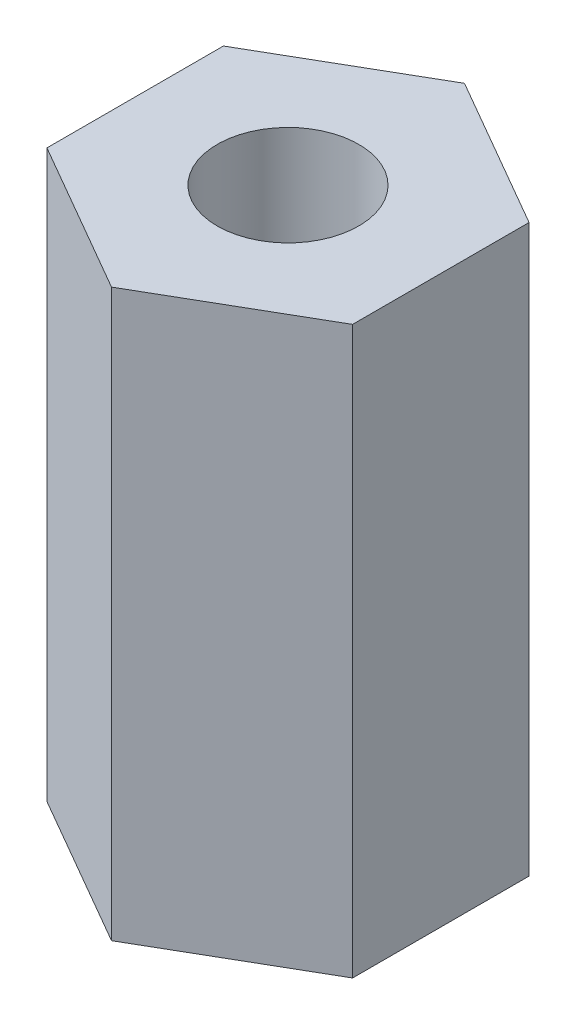
ISO-10303-21;
HEADER;
FILE_DESCRIPTION(('STEP AP214'),'2;1');
FILE_NAME('part.step','',(''),(''),'','','');
FILE_SCHEMA(('AUTOMOTIVE_DESIGN { 1 0 10303 214 1 1 1 1 }'));
ENDSEC;
DATA;
#1=APPLICATION_CONTEXT('core data for automotive mechanical design processes');
#2=APPLICATION_PROTOCOL_DEFINITION('international standard','automotive_design',2000,#1);
#3=PRODUCT_CONTEXT('',#1,'mechanical');
#4=PRODUCT('Part','Part','',(#3));
#5=PRODUCT_RELATED_PRODUCT_CATEGORY('part','',(#4));
#6=PRODUCT_DEFINITION_FORMATION('','',#4);
#7=PRODUCT_DEFINITION_CONTEXT('part definition',#1,'design');
#8=PRODUCT_DEFINITION('design','',#6,#7);
#9=PRODUCT_DEFINITION_SHAPE('','',#8);
#10=(LENGTH_UNIT() NAMED_UNIT(*) SI_UNIT(.MILLI.,.METRE.));
#11=(NAMED_UNIT(*) PLANE_ANGLE_UNIT() SI_UNIT($,.RADIAN.));
#12=(NAMED_UNIT(*) SI_UNIT($,.STERADIAN.) SOLID_ANGLE_UNIT());
#13=UNCERTAINTY_MEASURE_WITH_UNIT(LENGTH_MEASURE(1.E-05),#10,'distance_accuracy_value','');
#14=(GEOMETRIC_REPRESENTATION_CONTEXT(3) GLOBAL_UNCERTAINTY_ASSIGNED_CONTEXT((#13)) GLOBAL_UNIT_ASSIGNED_CONTEXT((#10,
#11,#12)) REPRESENTATION_CONTEXT('',''));
#15=CARTESIAN_POINT('',(0.,0.,0.));
#16=DIRECTION('',(0.,0.,1.));
#17=DIRECTION('',(1.,0.,0.));
#18=AXIS2_PLACEMENT_3D('',#15,#16,#17);
#19=CARTESIAN_POINT('',(2.7,10.,-1.55884572681199));
#20=DIRECTION('',(-0.5,0.,0.866025403784439));
#21=DIRECTION('',(0.866025403784439,0.,0.5));
#22=AXIS2_PLACEMENT_3D('',#19,#20,#21);
#23=PLANE('',#22);
#24=DIRECTION('',(-0.866025403784439,0.,-0.5));
#25=VECTOR('',#24,1.);
#26=CARTESIAN_POINT('',(2.7,0.,-1.55884572681199));
#27=LINE('',#26,#25);
#28=CARTESIAN_POINT('',(2.7,0.,-1.55884572681199));
#29=VERTEX_POINT('',#28);
#30=CARTESIAN_POINT('',(0.,0.,-3.11769145362398));
#31=VERTEX_POINT('',#30);
#32=EDGE_CURVE('E118',#29,#31,#27,.T.);
#33=ORIENTED_EDGE('',*,*,#32,.T.);
#34=DIRECTION('',(0.,-1.,0.));
#35=VECTOR('',#34,1.);
#36=CARTESIAN_POINT('',(0.,10.,-3.11769145362398));
#37=LINE('',#36,#35);
#38=CARTESIAN_POINT('',(0.,10.,-3.11769145362398));
#39=VERTEX_POINT('',#38);
#40=EDGE_CURVE('E11',#39,#31,#37,.T.);
#41=ORIENTED_EDGE('',*,*,#40,.F.);
#42=DIRECTION('',(-0.866025403784439,0.,-0.5));
#43=VECTOR('',#42,1.);
#44=CARTESIAN_POINT('',(2.7,10.,-1.55884572681199));
#45=LINE('',#44,#43);
#46=CARTESIAN_POINT('',(2.7,10.,-1.55884572681199));
#47=VERTEX_POINT('',#46);
#48=EDGE_CURVE('E129',#47,#39,#45,.T.);
#49=ORIENTED_EDGE('',*,*,#48,.F.);
#50=DIRECTION('',(0.,-1.,0.));
#51=VECTOR('',#50,1.);
#52=CARTESIAN_POINT('',(2.7,10.,-1.55884572681199));
#53=LINE('',#52,#51);
#54=EDGE_CURVE('E114',#47,#29,#53,.T.);
#55=ORIENTED_EDGE('',*,*,#54,.T.);
#56=EDGE_LOOP('',(#33,#41,#49,#55));
#57=FACE_BOUND('',#56,.T.);
#58=ADVANCED_FACE('F34',(#57),#23,.F.);
#59=CARTESIAN_POINT('',(0.,10.,-3.11769145362398));
#60=DIRECTION('',(0.5,0.,0.866025403784439));
#61=DIRECTION('',(0.866025403784439,0.,-0.5));
#62=AXIS2_PLACEMENT_3D('',#59,#60,#61);
#63=PLANE('',#62);
#64=DIRECTION('',(-0.866025403784439,0.,0.5));
#65=VECTOR('',#64,1.);
#66=CARTESIAN_POINT('',(0.,0.,-3.11769145362398));
#67=LINE('',#66,#65);
#68=CARTESIAN_POINT('',(-2.7,0.,-1.55884572681199));
#69=VERTEX_POINT('',#68);
#70=EDGE_CURVE('E121',#31,#69,#67,.T.);
#71=ORIENTED_EDGE('',*,*,#70,.T.);
#72=DIRECTION('',(0.,-1.,0.));
#73=VECTOR('',#72,1.);
#74=CARTESIAN_POINT('',(-2.7,10.,-1.55884572681199));
#75=LINE('',#74,#73);
#76=CARTESIAN_POINT('',(-2.7,10.,-1.55884572681199));
#77=VERTEX_POINT('',#76);
#78=EDGE_CURVE('E42',#77,#69,#75,.T.);
#79=ORIENTED_EDGE('',*,*,#78,.F.);
#80=DIRECTION('',(-0.866025403784439,0.,0.5));
#81=VECTOR('',#80,1.);
#82=CARTESIAN_POINT('',(0.,10.,-3.11769145362398));
#83=LINE('',#82,#81);
#84=EDGE_CURVE('E87',#39,#77,#83,.T.);
#85=ORIENTED_EDGE('',*,*,#84,.F.);
#86=ORIENTED_EDGE('',*,*,#40,.T.);
#87=EDGE_LOOP('',(#71,#79,#85,#86));
#88=FACE_BOUND('',#87,.T.);
#89=ADVANCED_FACE('F154',(#88),#63,.F.);
#90=CARTESIAN_POINT('',(-2.7,10.,-1.55884572681199));
#91=DIRECTION('',(1.,0.,0.));
#92=DIRECTION('',(0.,0.,-1.));
#93=AXIS2_PLACEMENT_3D('',#90,#91,#92);
#94=PLANE('',#93);
#95=DIRECTION('',(0.,0.,1.));
#96=VECTOR('',#95,1.);
#97=CARTESIAN_POINT('',(-2.7,0.,-1.55884572681199));
#98=LINE('',#97,#96);
#99=CARTESIAN_POINT('',(-2.7,0.,1.55884572681199));
#100=VERTEX_POINT('',#99);
#101=EDGE_CURVE('E124',#69,#100,#98,.T.);
#102=ORIENTED_EDGE('',*,*,#101,.T.);
#103=DIRECTION('',(0.,-1.,0.));
#104=VECTOR('',#103,1.);
#105=CARTESIAN_POINT('',(-2.7,10.,1.55884572681199));
#106=LINE('',#105,#104);
#107=CARTESIAN_POINT('',(-2.7,10.,1.55884572681199));
#108=VERTEX_POINT('',#107);
#109=EDGE_CURVE('E109',#108,#100,#106,.T.);
#110=ORIENTED_EDGE('',*,*,#109,.F.);
#111=DIRECTION('',(0.,0.,1.));
#112=VECTOR('',#111,1.);
#113=CARTESIAN_POINT('',(-2.7,10.,-1.55884572681199));
#114=LINE('',#113,#112);
#115=EDGE_CURVE('E100',#77,#108,#114,.T.);
#116=ORIENTED_EDGE('',*,*,#115,.F.);
#117=ORIENTED_EDGE('',*,*,#78,.T.);
#118=EDGE_LOOP('',(#102,#110,#116,#117));
#119=FACE_BOUND('',#118,.T.);
#120=ADVANCED_FACE('F135',(#119),#94,.F.);
#121=CARTESIAN_POINT('',(-2.7,10.,1.55884572681199));
#122=DIRECTION('',(0.5,0.,-0.866025403784438));
#123=DIRECTION('',(-0.866025403784439,0.,-0.5));
#124=AXIS2_PLACEMENT_3D('',#121,#122,#123);
#125=PLANE('',#124);
#126=DIRECTION('',(0.866025403784439,0.,0.5));
#127=VECTOR('',#126,1.);
#128=CARTESIAN_POINT('',(-2.7,0.,1.55884572681199));
#129=LINE('',#128,#127);
#130=CARTESIAN_POINT('',(0.,0.,3.11769145362398));
#131=VERTEX_POINT('',#130);
#132=EDGE_CURVE('E108',#100,#131,#129,.T.);
#133=ORIENTED_EDGE('',*,*,#132,.T.);
#134=DIRECTION('',(0.,-1.,0.));
#135=VECTOR('',#134,1.);
#136=CARTESIAN_POINT('',(0.,10.,3.11769145362398));
#137=LINE('',#136,#135);
#138=CARTESIAN_POINT('',(0.,10.,3.11769145362398));
#139=VERTEX_POINT('',#138);
#140=EDGE_CURVE('E105',#139,#131,#137,.T.);
#141=ORIENTED_EDGE('',*,*,#140,.F.);
#142=DIRECTION('',(0.866025403784439,0.,0.5));
#143=VECTOR('',#142,1.);
#144=CARTESIAN_POINT('',(-2.7,10.,1.55884572681199));
#145=LINE('',#144,#143);
#146=EDGE_CURVE('E94',#108,#139,#145,.T.);
#147=ORIENTED_EDGE('',*,*,#146,.F.);
#148=ORIENTED_EDGE('',*,*,#109,.T.);
#149=EDGE_LOOP('',(#133,#141,#147,#148));
#150=FACE_BOUND('',#149,.T.);
#151=ADVANCED_FACE('F106',(#150),#125,.F.);
#152=CARTESIAN_POINT('',(0.,10.,3.11769145362398));
#153=DIRECTION('',(-0.5,0.,-0.866025403784439));
#154=DIRECTION('',(-0.866025403784439,0.,0.5));
#155=AXIS2_PLACEMENT_3D('',#152,#153,#154);
#156=PLANE('',#155);
#157=DIRECTION('',(0.866025403784439,0.,-0.5));
#158=VECTOR('',#157,1.);
#159=CARTESIAN_POINT('',(0.,0.,3.11769145362398));
#160=LINE('',#159,#158);
#161=CARTESIAN_POINT('',(2.7,0.,1.55884572681199));
#162=VERTEX_POINT('',#161);
#163=EDGE_CURVE('E73',#131,#162,#160,.T.);
#164=ORIENTED_EDGE('',*,*,#163,.T.);
#165=DIRECTION('',(0.,-1.,0.));
#166=VECTOR('',#165,1.);
#167=CARTESIAN_POINT('',(2.7,10.,1.55884572681199));
#168=LINE('',#167,#166);
#169=CARTESIAN_POINT('',(2.7,10.,1.55884572681199));
#170=VERTEX_POINT('',#169);
#171=EDGE_CURVE('E110',#170,#162,#168,.T.);
#172=ORIENTED_EDGE('',*,*,#171,.F.);
#173=DIRECTION('',(0.866025403784439,0.,-0.5));
#174=VECTOR('',#173,1.);
#175=CARTESIAN_POINT('',(0.,10.,3.11769145362398));
#176=LINE('',#175,#174);
#177=EDGE_CURVE('E98',#139,#170,#176,.T.);
#178=ORIENTED_EDGE('',*,*,#177,.F.);
#179=ORIENTED_EDGE('',*,*,#140,.T.);
#180=EDGE_LOOP('',(#164,#172,#178,#179));
#181=FACE_BOUND('',#180,.T.);
#182=ADVANCED_FACE('F112',(#181),#156,.F.);
#183=CARTESIAN_POINT('',(2.7,10.,1.55884572681199));
#184=DIRECTION('',(-1.,0.,0.));
#185=DIRECTION('',(0.,0.,1.));
#186=AXIS2_PLACEMENT_3D('',#183,#184,#185);
#187=PLANE('',#186);
#188=DIRECTION('',(0.,0.,-1.));
#189=VECTOR('',#188,1.);
#190=CARTESIAN_POINT('',(2.7,0.,1.55884572681199));
#191=LINE('',#190,#189);
#192=EDGE_CURVE('E79',#162,#29,#191,.T.);
#193=ORIENTED_EDGE('',*,*,#192,.T.);
#194=ORIENTED_EDGE('',*,*,#54,.F.);
#195=DIRECTION('',(0.,0.,-1.));
#196=VECTOR('',#195,1.);
#197=CARTESIAN_POINT('',(2.7,10.,1.55884572681199));
#198=LINE('',#197,#196);
#199=EDGE_CURVE('E50',#170,#47,#198,.T.);
#200=ORIENTED_EDGE('',*,*,#199,.F.);
#201=ORIENTED_EDGE('',*,*,#171,.T.);
#202=EDGE_LOOP('',(#193,#194,#200,#201));
#203=FACE_BOUND('',#202,.T.);
#204=ADVANCED_FACE('F142',(#203),#187,.F.);
#205=CARTESIAN_POINT('',(0.,10.,0.));
#206=DIRECTION('',(0.,1.,0.));
#207=DIRECTION('',(0.,0.,1.));
#208=AXIS2_PLACEMENT_3D('',#205,#206,#207);
#209=PLANE('',#208);
#210=CARTESIAN_POINT('',(0.,10.,0.));
#211=DIRECTION('',(0.,1.,0.));
#212=DIRECTION('',(0.,0.,1.));
#213=AXIS2_PLACEMENT_3D('',#210,#211,#212);
#214=CIRCLE('',#213,1.24999999999999);
#215=CARTESIAN_POINT('',(0.,10.,1.24999999999999));
#216=VERTEX_POINT('',#215);
#217=EDGE_CURVE('E211',#216,#216,#214,.T.);
#218=ORIENTED_EDGE('',*,*,#217,.F.);
#219=EDGE_LOOP('',(#218));
#220=FACE_BOUND('',#219,.T.);
#221=ORIENTED_EDGE('',*,*,#48,.T.);
#222=ORIENTED_EDGE('',*,*,#84,.T.);
#223=ORIENTED_EDGE('',*,*,#115,.T.);
#224=ORIENTED_EDGE('',*,*,#146,.T.);
#225=ORIENTED_EDGE('',*,*,#177,.T.);
#226=ORIENTED_EDGE('',*,*,#199,.T.);
#227=EDGE_LOOP('',(#221,#222,#223,#224,#225,#226));
#228=FACE_BOUND('',#227,.T.);
#229=ADVANCED_FACE('F96',(#220,#228),#209,.T.);
#230=CARTESIAN_POINT('',(0.,0.,0.));
#231=DIRECTION('',(0.,1.,0.));
#232=DIRECTION('',(0.,0.,1.));
#233=AXIS2_PLACEMENT_3D('',#230,#231,#232);
#234=PLANE('',#233);
#235=CARTESIAN_POINT('',(0.,0.,0.));
#236=DIRECTION('',(0.,1.,0.));
#237=DIRECTION('',(0.,0.,1.));
#238=AXIS2_PLACEMENT_3D('',#235,#236,#237);
#239=CIRCLE('',#238,1.25);
#240=CARTESIAN_POINT('',(0.,0.,1.25));
#241=VERTEX_POINT('',#240);
#242=EDGE_CURVE('E122',#241,#241,#239,.T.);
#243=ORIENTED_EDGE('',*,*,#242,.T.);
#244=EDGE_LOOP('',(#243));
#245=FACE_BOUND('',#244,.T.);
#246=ORIENTED_EDGE('',*,*,#32,.F.);
#247=ORIENTED_EDGE('',*,*,#192,.F.);
#248=ORIENTED_EDGE('',*,*,#163,.F.);
#249=ORIENTED_EDGE('',*,*,#132,.F.);
#250=ORIENTED_EDGE('',*,*,#101,.F.);
#251=ORIENTED_EDGE('',*,*,#70,.F.);
#252=EDGE_LOOP('',(#246,#247,#248,#249,#250,#251));
#253=FACE_BOUND('',#252,.T.);
#254=ADVANCED_FACE('F138',(#245,#253),#234,.F.);
#255=CARTESIAN_POINT('',(0.,10.,0.));
#256=DIRECTION('',(0.,1.,0.));
#257=DIRECTION('',(0.,0.,1.));
#258=AXIS2_PLACEMENT_3D('',#255,#256,#257);
#259=CYLINDRICAL_SURFACE('',#258,1.24999999999999);
#260=ORIENTED_EDGE('',*,*,#242,.F.);
#261=EDGE_LOOP('',(#260));
#262=FACE_BOUND('',#261,.T.);
#263=ORIENTED_EDGE('',*,*,#217,.T.);
#264=EDGE_LOOP('',(#263));
#265=FACE_BOUND('',#264,.T.);
#266=ADVANCED_FACE('F191',(#262,#265),#259,.F.);
#267=CLOSED_SHELL('',(#58,#89,#120,#151,#182,#204,#229,#254,#266));
#268=MANIFOLD_SOLID_BREP('B2',#267);
#269=ADVANCED_BREP_SHAPE_REPRESENTATION('',(#18,#268),#14);
#270=SHAPE_DEFINITION_REPRESENTATION(#9,#269);
ENDSEC;
END-ISO-10303-21;
